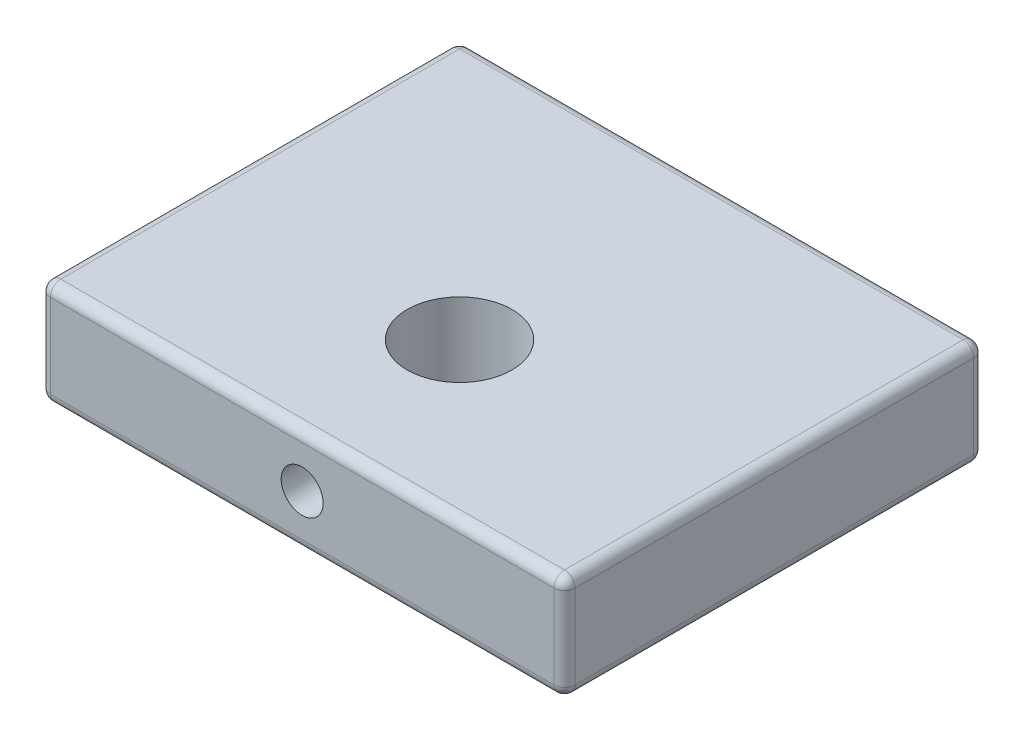
ISO-10303-21;
HEADER;
FILE_DESCRIPTION(('STEP AP214'),'2;1');
FILE_NAME('part.step','',(''),(''),'','','');
FILE_SCHEMA(('AUTOMOTIVE_DESIGN { 1 0 10303 214 1 1 1 1 }'));
ENDSEC;
DATA;
#1=APPLICATION_CONTEXT('core data for automotive mechanical design processes');
#2=APPLICATION_PROTOCOL_DEFINITION('international standard','automotive_design',2000,#1);
#3=PRODUCT_CONTEXT('',#1,'mechanical');
#4=PRODUCT('Part','Part','',(#3));
#5=PRODUCT_RELATED_PRODUCT_CATEGORY('part','',(#4));
#6=PRODUCT_DEFINITION_FORMATION('','',#4);
#7=PRODUCT_DEFINITION_CONTEXT('part definition',#1,'design');
#8=PRODUCT_DEFINITION('design','',#6,#7);
#9=PRODUCT_DEFINITION_SHAPE('','',#8);
#10=(LENGTH_UNIT() NAMED_UNIT(*) SI_UNIT(.MILLI.,.METRE.));
#11=(NAMED_UNIT(*) PLANE_ANGLE_UNIT() SI_UNIT($,.RADIAN.));
#12=(NAMED_UNIT(*) SI_UNIT($,.STERADIAN.) SOLID_ANGLE_UNIT());
#13=UNCERTAINTY_MEASURE_WITH_UNIT(LENGTH_MEASURE(1.E-05),#10,'distance_accuracy_value','');
#14=(GEOMETRIC_REPRESENTATION_CONTEXT(3) GLOBAL_UNCERTAINTY_ASSIGNED_CONTEXT((#13)) GLOBAL_UNIT_ASSIGNED_CONTEXT((#10,
#11,#12)) REPRESENTATION_CONTEXT('',''));
#15=CARTESIAN_POINT('',(0.,0.,0.));
#16=DIRECTION('',(0.,0.,1.));
#17=DIRECTION('',(1.,0.,0.));
#18=AXIS2_PLACEMENT_3D('',#15,#16,#17);
#19=CARTESIAN_POINT('',(0.,10.,0.));
#20=DIRECTION('',(0.,-1.,0.));
#21=DIRECTION('',(0.,0.,-1.));
#22=AXIS2_PLACEMENT_3D('',#19,#20,#21);
#23=PLANE('',#22);
#24=DIRECTION('',(-1.,0.,0.));
#25=VECTOR('',#24,1.);
#26=CARTESIAN_POINT('',(0.,10.,-24.));
#27=LINE('',#26,#25);
#28=CARTESIAN_POINT('',(24.,10.,-24.));
#29=VERTEX_POINT('',#28);
#30=CARTESIAN_POINT('',(-24.,10.,-24.));
#31=VERTEX_POINT('',#30);
#32=EDGE_CURVE('E169',#29,#31,#27,.T.);
#33=ORIENTED_EDGE('',*,*,#32,.T.);
#34=DIRECTION('',(0.,0.,1.));
#35=VECTOR('',#34,1.);
#36=CARTESIAN_POINT('',(-24.,10.,0.));
#37=LINE('',#36,#35);
#38=CARTESIAN_POINT('',(-24.,10.,14.));
#39=VERTEX_POINT('',#38);
#40=EDGE_CURVE('E140',#31,#39,#37,.T.);
#41=ORIENTED_EDGE('',*,*,#40,.T.);
#42=DIRECTION('',(1.,0.,0.));
#43=VECTOR('',#42,1.);
#44=CARTESIAN_POINT('',(0.,10.,14.));
#45=LINE('',#44,#43);
#46=CARTESIAN_POINT('',(24.,10.,14.));
#47=VERTEX_POINT('',#46);
#48=EDGE_CURVE('E158',#39,#47,#45,.T.);
#49=ORIENTED_EDGE('',*,*,#48,.T.);
#50=DIRECTION('',(0.,0.,-1.));
#51=VECTOR('',#50,1.);
#52=CARTESIAN_POINT('',(24.,10.,0.));
#53=LINE('',#52,#51);
#54=EDGE_CURVE('E164',#47,#29,#53,.T.);
#55=ORIENTED_EDGE('',*,*,#54,.T.);
#56=EDGE_LOOP('',(#33,#41,#49,#55));
#57=FACE_BOUND('',#56,.T.);
#58=CARTESIAN_POINT('',(0.,10.,0.));
#59=DIRECTION('',(0.,1.,0.));
#60=DIRECTION('',(0.,0.,1.));
#61=AXIS2_PLACEMENT_3D('',#58,#59,#60);
#62=CIRCLE('',#61,5.);
#63=CARTESIAN_POINT('',(0.,10.,5.));
#64=VERTEX_POINT('',#63);
#65=EDGE_CURVE('E165',#64,#64,#62,.T.);
#66=ORIENTED_EDGE('',*,*,#65,.F.);
#67=EDGE_LOOP('',(#66));
#68=FACE_BOUND('',#67,.T.);
#69=ADVANCED_FACE('F47',(#57,#68),#23,.F.);
#70=CARTESIAN_POINT('',(0.,0.,0.));
#71=DIRECTION('',(0.,-1.,0.));
#72=DIRECTION('',(0.,0.,-1.));
#73=AXIS2_PLACEMENT_3D('',#70,#71,#72);
#74=PLANE('',#73);
#75=DIRECTION('',(1.,0.,0.));
#76=VECTOR('',#75,1.);
#77=CARTESIAN_POINT('',(-25.,0.,14.));
#78=LINE('',#77,#76);
#79=CARTESIAN_POINT('',(24.,0.,14.));
#80=VERTEX_POINT('',#79);
#81=CARTESIAN_POINT('',(-24.,0.,14.));
#82=VERTEX_POINT('',#81);
#83=EDGE_CURVE('E191',#80,#82,#78,.F.);
#84=ORIENTED_EDGE('',*,*,#83,.T.);
#85=DIRECTION('',(0.,0.,1.));
#86=VECTOR('',#85,1.);
#87=CARTESIAN_POINT('',(-24.,0.,-25.));
#88=LINE('',#87,#86);
#89=CARTESIAN_POINT('',(-24.,0.,-24.));
#90=VERTEX_POINT('',#89);
#91=EDGE_CURVE('E197',#82,#90,#88,.F.);
#92=ORIENTED_EDGE('',*,*,#91,.T.);
#93=DIRECTION('',(-1.,0.,0.));
#94=VECTOR('',#93,1.);
#95=CARTESIAN_POINT('',(25.,0.,-24.));
#96=LINE('',#95,#94);
#97=CARTESIAN_POINT('',(24.,0.,-24.));
#98=VERTEX_POINT('',#97);
#99=EDGE_CURVE('E195',#90,#98,#96,.F.);
#100=ORIENTED_EDGE('',*,*,#99,.T.);
#101=DIRECTION('',(0.,0.,-1.));
#102=VECTOR('',#101,1.);
#103=CARTESIAN_POINT('',(24.,0.,15.));
#104=LINE('',#103,#102);
#105=EDGE_CURVE('E193',#98,#80,#104,.F.);
#106=ORIENTED_EDGE('',*,*,#105,.T.);
#107=EDGE_LOOP('',(#84,#92,#100,#106));
#108=FACE_BOUND('',#107,.T.);
#109=CARTESIAN_POINT('',(-11.3137084989848,0.,-11.3137084989847));
#110=DIRECTION('',(0.,-1.,0.));
#111=DIRECTION('',(0.,0.,-1.));
#112=AXIS2_PLACEMENT_3D('',#109,#110,#111);
#113=CIRCLE('',#112,0.750000000000002);
#114=CARTESIAN_POINT('',(-11.3137084989848,0.,-12.0637084989847));
#115=VERTEX_POINT('',#114);
#116=EDGE_CURVE('E456',#115,#115,#113,.T.);
#117=ORIENTED_EDGE('',*,*,#116,.F.);
#118=EDGE_LOOP('',(#117));
#119=FACE_BOUND('',#118,.T.);
#120=CARTESIAN_POINT('',(11.3137084989847,0.,-11.3137084989848));
#121=DIRECTION('',(0.,-1.,0.));
#122=DIRECTION('',(0.,0.,-1.));
#123=AXIS2_PLACEMENT_3D('',#120,#121,#122);
#124=CIRCLE('',#123,0.749999999999998);
#125=CARTESIAN_POINT('',(11.3137084989847,0.,-12.0637084989848));
#126=VERTEX_POINT('',#125);
#127=EDGE_CURVE('E460',#126,#126,#124,.T.);
#128=ORIENTED_EDGE('',*,*,#127,.F.);
#129=EDGE_LOOP('',(#128));
#130=FACE_BOUND('',#129,.T.);
#131=CARTESIAN_POINT('',(11.3137084989848,0.,11.3137084989847));
#132=DIRECTION('',(0.,-1.,0.));
#133=DIRECTION('',(0.,0.,-1.));
#134=AXIS2_PLACEMENT_3D('',#131,#132,#133);
#135=CIRCLE('',#134,0.749999999999998);
#136=CARTESIAN_POINT('',(11.3137084989848,0.,10.5637084989847));
#137=VERTEX_POINT('',#136);
#138=EDGE_CURVE('E288',#137,#137,#135,.T.);
#139=ORIENTED_EDGE('',*,*,#138,.F.);
#140=EDGE_LOOP('',(#139));
#141=FACE_BOUND('',#140,.T.);
#142=CARTESIAN_POINT('',(-11.3137084989847,0.,11.3137084989848));
#143=DIRECTION('',(0.,-1.,0.));
#144=DIRECTION('',(0.,0.,-1.));
#145=AXIS2_PLACEMENT_3D('',#142,#143,#144);
#146=CIRCLE('',#145,0.749999999999996);
#147=CARTESIAN_POINT('',(-11.3137084989847,0.,10.5637084989848));
#148=VERTEX_POINT('',#147);
#149=EDGE_CURVE('E467',#148,#148,#146,.T.);
#150=ORIENTED_EDGE('',*,*,#149,.F.);
#151=EDGE_LOOP('',(#150));
#152=FACE_BOUND('',#151,.T.);
#153=CARTESIAN_POINT('',(0.,0.,0.));
#154=DIRECTION('',(0.,1.,0.));
#155=DIRECTION('',(0.,0.,1.));
#156=AXIS2_PLACEMENT_3D('',#153,#154,#155);
#157=CIRCLE('',#156,5.);
#158=CARTESIAN_POINT('',(0.,0.,5.));
#159=VERTEX_POINT('',#158);
#160=EDGE_CURVE('E470',#159,#159,#157,.T.);
#161=ORIENTED_EDGE('',*,*,#160,.T.);
#162=EDGE_LOOP('',(#161));
#163=FACE_BOUND('',#162,.T.);
#164=ADVANCED_FACE('F334',(#108,#119,#130,#141,#152,#163),#74,.T.);
#165=CARTESIAN_POINT('',(25.,10.,-25.));
#166=DIRECTION('',(-1.,0.,0.));
#167=DIRECTION('',(0.,0.,1.));
#168=AXIS2_PLACEMENT_3D('',#165,#166,#167);
#169=PLANE('',#168);
#170=DIRECTION('',(0.,0.,-1.));
#171=VECTOR('',#170,1.);
#172=CARTESIAN_POINT('',(25.,9.,-25.));
#173=LINE('',#172,#171);
#174=CARTESIAN_POINT('',(25.,9.,-24.));
#175=VERTEX_POINT('',#174);
#176=CARTESIAN_POINT('',(25.,9.,14.));
#177=VERTEX_POINT('',#176);
#178=EDGE_CURVE('E56',#175,#177,#173,.F.);
#179=ORIENTED_EDGE('',*,*,#178,.T.);
#180=DIRECTION('',(0.,-1.,0.));
#181=VECTOR('',#180,1.);
#182=CARTESIAN_POINT('',(25.,10.,14.));
#183=LINE('',#182,#181);
#184=CARTESIAN_POINT('',(25.,0.999999999999999,14.));
#185=VERTEX_POINT('',#184);
#186=EDGE_CURVE('E11',#177,#185,#183,.T.);
#187=ORIENTED_EDGE('',*,*,#186,.T.);
#188=DIRECTION('',(0.,0.,-1.));
#189=VECTOR('',#188,1.);
#190=CARTESIAN_POINT('',(25.,0.999999999999999,-25.));
#191=LINE('',#190,#189);
#192=CARTESIAN_POINT('',(25.,0.999999999999999,-24.));
#193=VERTEX_POINT('',#192);
#194=EDGE_CURVE('E209',#185,#193,#191,.T.);
#195=ORIENTED_EDGE('',*,*,#194,.T.);
#196=DIRECTION('',(0.,-1.,0.));
#197=VECTOR('',#196,1.);
#198=CARTESIAN_POINT('',(25.,10.,-24.));
#199=LINE('',#198,#197);
#200=EDGE_CURVE('E67',#193,#175,#199,.F.);
#201=ORIENTED_EDGE('',*,*,#200,.T.);
#202=EDGE_LOOP('',(#179,#187,#195,#201));
#203=FACE_BOUND('',#202,.T.);
#204=ADVANCED_FACE('F337',(#203),#169,.F.);
#205=CARTESIAN_POINT('',(25.,10.,-25.));
#206=DIRECTION('',(0.,0.,1.));
#207=DIRECTION('',(1.,0.,0.));
#208=AXIS2_PLACEMENT_3D('',#205,#206,#207);
#209=PLANE('',#208);
#210=DIRECTION('',(0.,-1.,0.));
#211=VECTOR('',#210,1.);
#212=CARTESIAN_POINT('',(-24.,10.,-25.));
#213=LINE('',#212,#211);
#214=CARTESIAN_POINT('',(-24.,0.999999999999999,-25.));
#215=VERTEX_POINT('',#214);
#216=CARTESIAN_POINT('',(-24.,9.,-25.));
#217=VERTEX_POINT('',#216);
#218=EDGE_CURVE('E204',#215,#217,#213,.F.);
#219=ORIENTED_EDGE('',*,*,#218,.T.);
#220=DIRECTION('',(-1.,0.,0.));
#221=VECTOR('',#220,1.);
#222=CARTESIAN_POINT('',(25.,9.,-25.));
#223=LINE('',#222,#221);
#224=CARTESIAN_POINT('',(24.,9.,-25.));
#225=VERTEX_POINT('',#224);
#226=EDGE_CURVE('E206',#217,#225,#223,.F.);
#227=ORIENTED_EDGE('',*,*,#226,.T.);
#228=DIRECTION('',(0.,-1.,0.));
#229=VECTOR('',#228,1.);
#230=CARTESIAN_POINT('',(24.,10.,-25.));
#231=LINE('',#230,#229);
#232=CARTESIAN_POINT('',(24.,0.999999999999999,-25.));
#233=VERTEX_POINT('',#232);
#234=EDGE_CURVE('E200',#225,#233,#231,.T.);
#235=ORIENTED_EDGE('',*,*,#234,.T.);
#236=DIRECTION('',(-1.,0.,0.));
#237=VECTOR('',#236,1.);
#238=CARTESIAN_POINT('',(-25.,0.999999999999999,-25.));
#239=LINE('',#238,#237);
#240=EDGE_CURVE('E202',#233,#215,#239,.T.);
#241=ORIENTED_EDGE('',*,*,#240,.T.);
#242=EDGE_LOOP('',(#219,#227,#235,#241));
#243=FACE_BOUND('',#242,.T.);
#244=ADVANCED_FACE('F345',(#243),#209,.F.);
#245=CARTESIAN_POINT('',(-25.,10.,-25.));
#246=DIRECTION('',(1.,0.,0.));
#247=DIRECTION('',(0.,0.,-1.));
#248=AXIS2_PLACEMENT_3D('',#245,#246,#247);
#249=PLANE('',#248);
#250=DIRECTION('',(0.,-1.,0.));
#251=VECTOR('',#250,1.);
#252=CARTESIAN_POINT('',(-25.,10.,14.));
#253=LINE('',#252,#251);
#254=CARTESIAN_POINT('',(-25.,0.999999999999999,14.));
#255=VERTEX_POINT('',#254);
#256=CARTESIAN_POINT('',(-25.,9.,14.));
#257=VERTEX_POINT('',#256);
#258=EDGE_CURVE('E179',#255,#257,#253,.F.);
#259=ORIENTED_EDGE('',*,*,#258,.T.);
#260=DIRECTION('',(0.,0.,1.));
#261=VECTOR('',#260,1.);
#262=CARTESIAN_POINT('',(-25.,9.,-25.));
#263=LINE('',#262,#261);
#264=CARTESIAN_POINT('',(-25.,9.,-24.));
#265=VERTEX_POINT('',#264);
#266=EDGE_CURVE('E142',#257,#265,#263,.F.);
#267=ORIENTED_EDGE('',*,*,#266,.T.);
#268=DIRECTION('',(0.,-1.,0.));
#269=VECTOR('',#268,1.);
#270=CARTESIAN_POINT('',(-25.,10.,-24.));
#271=LINE('',#270,#269);
#272=CARTESIAN_POINT('',(-25.,0.999999999999999,-24.));
#273=VERTEX_POINT('',#272);
#274=EDGE_CURVE('E171',#265,#273,#271,.T.);
#275=ORIENTED_EDGE('',*,*,#274,.T.);
#276=DIRECTION('',(0.,0.,1.));
#277=VECTOR('',#276,1.);
#278=CARTESIAN_POINT('',(-25.,0.999999999999999,15.));
#279=LINE('',#278,#277);
#280=EDGE_CURVE('E173',#273,#255,#279,.T.);
#281=ORIENTED_EDGE('',*,*,#280,.T.);
#282=EDGE_LOOP('',(#259,#267,#275,#281));
#283=FACE_BOUND('',#282,.T.);
#284=ADVANCED_FACE('F341',(#283),#249,.F.);
#285=CARTESIAN_POINT('',(25.,10.,15.));
#286=DIRECTION('',(0.,0.,-1.));
#287=DIRECTION('',(-1.,0.,0.));
#288=AXIS2_PLACEMENT_3D('',#285,#286,#287);
#289=PLANE('',#288);
#290=DIRECTION('',(0.,-1.,0.));
#291=VECTOR('',#290,1.);
#292=CARTESIAN_POINT('',(-24.,10.,15.));
#293=LINE('',#292,#291);
#294=CARTESIAN_POINT('',(-24.,9.,15.));
#295=VERTEX_POINT('',#294);
#296=CARTESIAN_POINT('',(-24.,0.999999999999999,15.));
#297=VERTEX_POINT('',#296);
#298=EDGE_CURVE('E186',#295,#297,#293,.T.);
#299=ORIENTED_EDGE('',*,*,#298,.T.);
#300=DIRECTION('',(1.,0.,0.));
#301=VECTOR('',#300,1.);
#302=CARTESIAN_POINT('',(25.,0.999999999999999,15.));
#303=LINE('',#302,#301);
#304=CARTESIAN_POINT('',(24.,0.999999999999999,15.));
#305=VERTEX_POINT('',#304);
#306=EDGE_CURVE('E189',#297,#305,#303,.T.);
#307=ORIENTED_EDGE('',*,*,#306,.T.);
#308=DIRECTION('',(0.,-1.,0.));
#309=VECTOR('',#308,1.);
#310=CARTESIAN_POINT('',(24.,10.,15.));
#311=LINE('',#310,#309);
#312=CARTESIAN_POINT('',(24.,9.,15.));
#313=VERTEX_POINT('',#312);
#314=EDGE_CURVE('E184',#305,#313,#311,.F.);
#315=ORIENTED_EDGE('',*,*,#314,.T.);
#316=DIRECTION('',(1.,0.,0.));
#317=VECTOR('',#316,1.);
#318=CARTESIAN_POINT('',(25.,9.,15.));
#319=LINE('',#318,#317);
#320=EDGE_CURVE('E182',#313,#295,#319,.F.);
#321=ORIENTED_EDGE('',*,*,#320,.T.);
#322=EDGE_LOOP('',(#299,#307,#315,#321));
#323=FACE_BOUND('',#322,.T.);
#324=CARTESIAN_POINT('',(0.,5.,15.));
#325=DIRECTION('',(0.,0.,1.));
#326=DIRECTION('',(1.,0.,0.));
#327=AXIS2_PLACEMENT_3D('',#324,#325,#326);
#328=CIRCLE('',#327,2.);
#329=CARTESIAN_POINT('',(2.,5.,15.));
#330=VERTEX_POINT('',#329);
#331=EDGE_CURVE('E275',#330,#330,#328,.T.);
#332=ORIENTED_EDGE('',*,*,#331,.F.);
#333=EDGE_LOOP('',(#332));
#334=FACE_BOUND('',#333,.T.);
#335=ADVANCED_FACE('F331',(#323,#334),#289,.F.);
#336=CARTESIAN_POINT('',(0.,10.,0.));
#337=DIRECTION('',(0.,-1.,0.));
#338=DIRECTION('',(0.,0.,-1.));
#339=AXIS2_PLACEMENT_3D('',#336,#337,#338);
#340=CYLINDRICAL_SURFACE('',#339,5.);
#341=CARTESIAN_POINT('',(2.,5.,4.58257569495584));
#342=CARTESIAN_POINT('',(1.99999540068023,5.10712368971296,4.58258022779737));
#343=CARTESIAN_POINT('',(1.99134173553407,5.21442629433184,4.58638433797122));
#344=CARTESIAN_POINT('',(1.95706710874823,5.42593908409957,4.601110833066));
#345=CARTESIAN_POINT('',(1.93140279032341,5.53014065433852,4.61205140628347));
#346=CARTESIAN_POINT('',(1.86423554476216,5.73205180897083,4.63960410719222));
#347=CARTESIAN_POINT('',(1.82279228998551,5.82978424329122,4.65619484260882));
#348=CARTESIAN_POINT('',(1.72542013194152,6.0168853548623,4.69314677188873));
#349=CARTESIAN_POINT('',(1.66949439157707,6.10625585252411,4.71350714220611));
#350=CARTESIAN_POINT('',(1.54132201423254,6.27926031454433,4.75700861562336));
#351=CARTESIAN_POINT('',(1.46837936836551,6.36235639939724,4.78023917022606));
#352=CARTESIAN_POINT('',(1.30970909513216,6.5155290208558,4.82612457915277));
#353=CARTESIAN_POINT('',(1.22397701877347,6.5856010077097,4.84877922991761));
#354=CARTESIAN_POINT('',(1.03800631337303,6.71340639030971,4.89203407641395));
#355=CARTESIAN_POINT('',(0.937328966419096,6.77054429968594,4.9125180361257));
#356=CARTESIAN_POINT('',(0.726825322068641,6.86684357017379,4.94803927702516));
#357=CARTESIAN_POINT('',(0.617002769076886,6.90601224624887,4.96307877403249));
#358=CARTESIAN_POINT('',(0.396966427039757,6.96334148599309,4.98538324990609));
#359=CARTESIAN_POINT('',(0.28702898485832,6.98242731397022,4.99298936770628));
#360=CARTESIAN_POINT('',(0.0652663285839653,7.00202848578145,5.00080310687431));
#361=CARTESIAN_POINT('',(-0.046558165839408,7.0025507559658,5.00101348770556));
#362=CARTESIAN_POINT('',(-0.262232494702086,6.9855172301958,4.99421962820612));
#363=CARTESIAN_POINT('',(-0.366177452870454,6.96897522724529,4.98761996771485));
#364=CARTESIAN_POINT('',(-0.569673109221911,6.92000712369703,4.96849291469141));
#365=CARTESIAN_POINT('',(-0.669223484391236,6.88757985760154,4.95596508721342));
#366=CARTESIAN_POINT('',(-0.862897938510555,6.80736351712174,4.92596824457467));
#367=CARTESIAN_POINT('',(-0.956917623378892,6.75935028518462,4.90842760466223));
#368=CARTESIAN_POINT('',(-1.13580815074131,6.64953499308084,4.87014585180275));
#369=CARTESIAN_POINT('',(-1.22067584271796,6.58772820689983,4.84940364267149));
#370=CARTESIAN_POINT('',(-1.38476882799017,6.44735086405612,4.80521637176123));
#371=CARTESIAN_POINT('',(-1.46325784526632,6.3679461074272,4.78168326511759));
#372=CARTESIAN_POINT('',(-1.60610741539265,6.197009428168,4.73561660973263));
#373=CARTESIAN_POINT('',(-1.67046334378698,6.1054735518044,4.71308339008077));
#374=CARTESIAN_POINT('',(-1.78490418871927,5.90958097762606,4.67096897409023));
#375=CARTESIAN_POINT('',(-1.83453465163626,5.80493516966135,4.65148914057708));
#376=CARTESIAN_POINT('',(-1.91517625986646,5.58778450968778,4.61887590344085));
#377=CARTESIAN_POINT('',(-1.94619949837798,5.47528481527341,4.60573837891311));
#378=CARTESIAN_POINT('',(-1.98695494885489,5.25296422253257,4.58829759702716));
#379=CARTESIAN_POINT('',(-1.99787209681454,5.14339955287144,4.58350366456138));
#380=CARTESIAN_POINT('',(-2.00156132644288,4.92392279224044,4.58189497869038));
#381=CARTESIAN_POINT('',(-1.99433891059128,4.81401081672435,4.58507780560362));
#382=CARTESIAN_POINT('',(-1.96303289479003,4.60354106504306,4.59856044359114));
#383=CARTESIAN_POINT('',(-1.93993306202386,4.50280706259994,4.60844457798302));
#384=CARTESIAN_POINT('',(-1.87880418691087,4.30671159521455,4.6337005102734));
#385=CARTESIAN_POINT('',(-1.84077183430227,4.21135132689285,4.64907352488598));
#386=CARTESIAN_POINT('',(-1.74913563948157,4.02439764220435,4.68433781860101));
#387=CARTESIAN_POINT('',(-1.69496286826465,3.93311381130547,4.70438704639177));
#388=CARTESIAN_POINT('',(-1.57316522444182,3.76051701255841,4.74650385157795));
#389=CARTESIAN_POINT('',(-1.50553487348189,3.67920812720455,4.76857224896045));
#390=CARTESIAN_POINT('',(-1.35284421168058,3.52262659140063,4.81420915971416));
#391=CARTESIAN_POINT('',(-1.26686542944543,3.4482434347084,4.83776807285233));
#392=CARTESIAN_POINT('',(-1.0830836333685,3.31482292339023,4.88219794567532));
#393=CARTESIAN_POINT('',(-0.985280138466608,3.25578619340488,4.90306879593136));
#394=CARTESIAN_POINT('',(-0.780279934003015,3.15495237353666,4.9398371590039));
#395=CARTESIAN_POINT('',(-0.673085480998744,3.11315115582634,4.9557358624066));
#396=CARTESIAN_POINT('',(-0.452393590914547,3.04845114760024,4.98072713468904));
#397=CARTESIAN_POINT('',(-0.338899610276819,3.02554209858931,4.98982339706103));
#398=CARTESIAN_POINT('',(-0.116816510362615,3.00049529834716,4.99979008211858));
#399=CARTESIAN_POINT('',(-0.00839049265208641,2.99709987143797,5.00115846749745));
#400=CARTESIAN_POINT('',(0.207433835792266,3.00785547938347,4.99686042373721));
#401=CARTESIAN_POINT('',(0.314832299614387,3.02200385815558,4.99119505948774));
#402=CARTESIAN_POINT('',(0.522170901733398,3.06654678799988,4.97371513381836));
#403=CARTESIAN_POINT('',(0.622238803864869,3.09642894475655,4.96209480698998));
#404=CARTESIAN_POINT('',(0.815922355542604,3.17105280588107,4.93394947767358));
#405=CARTESIAN_POINT('',(0.909536811189122,3.21579725093909,4.91742357062859));
#406=CARTESIAN_POINT('',(1.09220303880515,3.32110319335323,4.88018094611867));
#407=CARTESIAN_POINT('',(1.18087037518738,3.38227627532513,4.859311306872));
#408=CARTESIAN_POINT('',(1.34705404014793,3.51778853874699,4.8158940222708));
#409=CARTESIAN_POINT('',(1.42456572919735,3.59213316960821,4.79334568464253));
#410=CARTESIAN_POINT('',(1.57120121894449,3.75731514684866,4.7473776736768));
#411=CARTESIAN_POINT('',(1.63950871002775,3.8488885751441,4.72399047228096));
#412=CARTESIAN_POINT('',(1.75984762763149,4.04294243572083,4.68049656850749));
#413=CARTESIAN_POINT('',(1.81187714055767,4.14542414845354,4.66039025195448));
#414=CARTESIAN_POINT('',(1.89399048451634,4.3490361864702,4.62758914239063));
#415=CARTESIAN_POINT('',(1.92562535665267,4.44946160271244,4.61439096680415));
#416=CARTESIAN_POINT('',(1.97271990928489,4.65448904149264,4.5944582603412));
#417=CARTESIAN_POINT('',(1.98822466191608,4.75907857342435,4.58770572290435));
#418=CARTESIAN_POINT('',(1.99692202185513,4.88677823911152,4.5839176394209));
#419=CARTESIAN_POINT('',(1.99807530751895,4.90940148035643,4.58341531117284));
#420=CARTESIAN_POINT('',(1.99961481124251,4.95468047679722,4.58274384722722));
#421=CARTESIAN_POINT('',(2.0000009730612,4.97733623425516,4.5825747359592));
#422=CARTESIAN_POINT('',(2.,5.,4.58257569495584));
#423=B_SPLINE_CURVE_WITH_KNOTS('',3,(#341,#342,#343,#344,#345,#346,#347,#348,#349,#350,#351,
#352,#353,#354,#355,#356,#357,#358,#359,#360,#361,#362,#363,#364,#365,#366,#367,#368,#369,#370,
#371,#372,#373,#374,#375,#376,#377,#378,#379,#380,#381,#382,#383,#384,#385,#386,#387,#388,#389,
#390,#391,#392,#393,#394,#395,#396,#397,#398,#399,#400,#401,#402,#403,#404,#405,#406,#407,#408,
#409,#410,#411,#412,#413,#414,#415,#416,#417,#418,#419,#420,#421,#422),.UNSPECIFIED.,.T.,.F.,(4,
2,2,2,2,2,2,2,2,2,2,2,2,2,2,2,2,2,2,2,2,2,2,2,2,2,2,2,2,2,2,2,2,2,2,2,2,2,2,2,4),(0.,
0.321277648767653,0.643377335822245,0.96427082329339,1.28509428823861,1.62255618284425,
1.96013574348342,2.31102669091428,2.6617746696948,2.99554182887183,3.32918445305672,
3.64408644830302,3.95901155129059,4.27868300234898,4.59846414940031,4.93924044081355,
5.28012807127127,5.63064458717257,5.98093304800101,6.3098214752442,6.63861014907939,
6.94867248085145,7.25880358651637,7.581511546527,7.90435114525849,8.25103734246979,
8.59773764852747,8.94435487312812,9.29078375954136,9.61461039755952,9.93838801512601,
10.2522199444335,10.5661097782858,10.8938705113992,11.2217671656421,11.5699625328561,
11.9181988175919,12.2351666081908,12.5512463021924,12.619212852096,12.6871843847255),.UNSPECIFIED.);
#424=CARTESIAN_POINT('',(2.,5.,4.58257569495584));
#425=VERTEX_POINT('',#424);
#426=EDGE_CURVE('E269',#425,#425,#423,.T.);
#427=ORIENTED_EDGE('',*,*,#426,.T.);
#428=EDGE_LOOP('',(#427));
#429=FACE_BOUND('',#428,.T.);
#430=ORIENTED_EDGE('',*,*,#65,.T.);
#431=EDGE_LOOP('',(#430));
#432=FACE_BOUND('',#431,.T.);
#433=ORIENTED_EDGE('',*,*,#160,.F.);
#434=EDGE_LOOP('',(#433));
#435=FACE_BOUND('',#434,.T.);
#436=ADVANCED_FACE('F327',(#429,#432,#435),#340,.F.);
#437=CARTESIAN_POINT('',(-11.3137084989847,5.,11.3137084989848));
#438=DIRECTION('',(0.,-1.,0.));
#439=DIRECTION('',(0.,0.,-1.));
#440=AXIS2_PLACEMENT_3D('',#437,#438,#439);
#441=CYLINDRICAL_SURFACE('',#440,0.749999999999996);
#442=CARTESIAN_POINT('',(-11.3137084989847,5.,11.3137084989848));
#443=DIRECTION('',(0.,-1.,0.));
#444=DIRECTION('',(0.,0.,-1.));
#445=AXIS2_PLACEMENT_3D('',#442,#443,#444);
#446=CIRCLE('',#445,0.749999999999996);
#447=CARTESIAN_POINT('',(-11.3137084989847,5.,10.5637084989848));
#448=VERTEX_POINT('',#447);
#449=EDGE_CURVE('E472',#448,#448,#446,.T.);
#450=ORIENTED_EDGE('',*,*,#449,.F.);
#451=EDGE_LOOP('',(#450));
#452=FACE_BOUND('',#451,.T.);
#453=ORIENTED_EDGE('',*,*,#149,.T.);
#454=EDGE_LOOP('',(#453));
#455=FACE_BOUND('',#454,.T.);
#456=ADVANCED_FACE('F323',(#452,#455),#441,.F.);
#457=CARTESIAN_POINT('',(-11.3137084989847,5.,11.3137084989848));
#458=DIRECTION('',(0.,-1.,0.));
#459=DIRECTION('',(0.,0.,-1.));
#460=AXIS2_PLACEMENT_3D('',#457,#458,#459);
#461=PLANE('',#460);
#462=ORIENTED_EDGE('',*,*,#449,.T.);
#463=EDGE_LOOP('',(#462));
#464=FACE_BOUND('',#463,.T.);
#465=ADVANCED_FACE('F301',(#464),#461,.T.);
#466=CARTESIAN_POINT('',(11.3137084989848,5.,11.3137084989847));
#467=DIRECTION('',(0.,-1.,0.));
#468=DIRECTION('',(0.,0.,-1.));
#469=AXIS2_PLACEMENT_3D('',#466,#467,#468);
#470=CYLINDRICAL_SURFACE('',#469,0.749999999999998);
#471=CARTESIAN_POINT('',(11.3137084989848,5.,11.3137084989847));
#472=DIRECTION('',(0.,-1.,0.));
#473=DIRECTION('',(0.,0.,-1.));
#474=AXIS2_PLACEMENT_3D('',#471,#472,#473);
#475=CIRCLE('',#474,0.749999999999998);
#476=CARTESIAN_POINT('',(11.3137084989848,5.,10.5637084989847));
#477=VERTEX_POINT('',#476);
#478=EDGE_CURVE('E486',#477,#477,#475,.T.);
#479=ORIENTED_EDGE('',*,*,#478,.F.);
#480=EDGE_LOOP('',(#479));
#481=FACE_BOUND('',#480,.T.);
#482=ORIENTED_EDGE('',*,*,#138,.T.);
#483=EDGE_LOOP('',(#482));
#484=FACE_BOUND('',#483,.T.);
#485=ADVANCED_FACE('F297',(#481,#484),#470,.F.);
#486=CARTESIAN_POINT('',(11.3137084989848,5.,11.3137084989847));
#487=DIRECTION('',(0.,-1.,0.));
#488=DIRECTION('',(0.,0.,-1.));
#489=AXIS2_PLACEMENT_3D('',#486,#487,#488);
#490=PLANE('',#489);
#491=ORIENTED_EDGE('',*,*,#478,.T.);
#492=EDGE_LOOP('',(#491));
#493=FACE_BOUND('',#492,.T.);
#494=ADVANCED_FACE('F300',(#493),#490,.T.);
#495=CARTESIAN_POINT('',(11.3137084989847,5.,-11.3137084989848));
#496=DIRECTION('',(0.,-1.,0.));
#497=DIRECTION('',(0.,0.,-1.));
#498=AXIS2_PLACEMENT_3D('',#495,#496,#497);
#499=CYLINDRICAL_SURFACE('',#498,0.749999999999998);
#500=CARTESIAN_POINT('',(11.3137084989847,5.,-11.3137084989848));
#501=DIRECTION('',(0.,-1.,0.));
#502=DIRECTION('',(0.,0.,-1.));
#503=AXIS2_PLACEMENT_3D('',#500,#501,#502);
#504=CIRCLE('',#503,0.749999999999998);
#505=CARTESIAN_POINT('',(11.3137084989847,5.,-12.0637084989848));
#506=VERTEX_POINT('',#505);
#507=EDGE_CURVE('E483',#506,#506,#504,.T.);
#508=ORIENTED_EDGE('',*,*,#507,.F.);
#509=EDGE_LOOP('',(#508));
#510=FACE_BOUND('',#509,.T.);
#511=ORIENTED_EDGE('',*,*,#127,.T.);
#512=EDGE_LOOP('',(#511));
#513=FACE_BOUND('',#512,.T.);
#514=ADVANCED_FACE('F305',(#510,#513),#499,.F.);
#515=CARTESIAN_POINT('',(11.3137084989847,5.,-11.3137084989848));
#516=DIRECTION('',(0.,-1.,0.));
#517=DIRECTION('',(0.,0.,-1.));
#518=AXIS2_PLACEMENT_3D('',#515,#516,#517);
#519=PLANE('',#518);
#520=ORIENTED_EDGE('',*,*,#507,.T.);
#521=EDGE_LOOP('',(#520));
#522=FACE_BOUND('',#521,.T.);
#523=ADVANCED_FACE('F309',(#522),#519,.T.);
#524=CARTESIAN_POINT('',(-11.3137084989848,5.,-11.3137084989847));
#525=DIRECTION('',(0.,-1.,0.));
#526=DIRECTION('',(0.,0.,-1.));
#527=AXIS2_PLACEMENT_3D('',#524,#525,#526);
#528=CYLINDRICAL_SURFACE('',#527,0.750000000000002);
#529=CARTESIAN_POINT('',(-11.3137084989848,5.,-11.3137084989847));
#530=DIRECTION('',(0.,-1.,0.));
#531=DIRECTION('',(0.,0.,-1.));
#532=AXIS2_PLACEMENT_3D('',#529,#530,#531);
#533=CIRCLE('',#532,0.750000000000002);
#534=CARTESIAN_POINT('',(-11.3137084989848,5.,-12.0637084989847));
#535=VERTEX_POINT('',#534);
#536=EDGE_CURVE('E280',#535,#535,#533,.T.);
#537=ORIENTED_EDGE('',*,*,#536,.F.);
#538=EDGE_LOOP('',(#537));
#539=FACE_BOUND('',#538,.T.);
#540=ORIENTED_EDGE('',*,*,#116,.T.);
#541=EDGE_LOOP('',(#540));
#542=FACE_BOUND('',#541,.T.);
#543=ADVANCED_FACE('F313',(#539,#542),#528,.F.);
#544=CARTESIAN_POINT('',(-11.3137084989848,5.,-11.3137084989847));
#545=DIRECTION('',(0.,-1.,0.));
#546=DIRECTION('',(0.,0.,-1.));
#547=AXIS2_PLACEMENT_3D('',#544,#545,#546);
#548=PLANE('',#547);
#549=ORIENTED_EDGE('',*,*,#536,.T.);
#550=EDGE_LOOP('',(#549));
#551=FACE_BOUND('',#550,.T.);
#552=ADVANCED_FACE('F295',(#551),#548,.T.);
#553=CARTESIAN_POINT('',(0.,5.,-25.001));
#554=DIRECTION('',(0.,0.,1.));
#555=DIRECTION('',(1.,0.,0.));
#556=AXIS2_PLACEMENT_3D('',#553,#554,#555);
#557=CYLINDRICAL_SURFACE('',#556,2.);
#558=ORIENTED_EDGE('',*,*,#426,.F.);
#559=EDGE_LOOP('',(#558));
#560=FACE_BOUND('',#559,.T.);
#561=ORIENTED_EDGE('',*,*,#331,.T.);
#562=EDGE_LOOP('',(#561));
#563=FACE_BOUND('',#562,.T.);
#564=ADVANCED_FACE('F290',(#560,#563),#557,.F.);
#565=CARTESIAN_POINT('',(24.,0.999999999999999,-25.));
#566=DIRECTION('',(0.,0.,1.));
#567=DIRECTION('',(1.,0.,0.));
#568=AXIS2_PLACEMENT_3D('',#565,#566,#567);
#569=CYLINDRICAL_SURFACE('',#568,1.);
#570=CARTESIAN_POINT('',(24.,0.999999999999999,-24.));
#571=DIRECTION('',(0.,0.,-1.));
#572=DIRECTION('',(-1.,0.,0.));
#573=AXIS2_PLACEMENT_3D('',#570,#571,#572);
#574=CIRCLE('',#573,1.);
#575=EDGE_CURVE('E51',#193,#98,#574,.T.);
#576=ORIENTED_EDGE('',*,*,#575,.F.);
#577=ORIENTED_EDGE('',*,*,#194,.F.);
#578=CARTESIAN_POINT('',(24.,1.,14.));
#579=DIRECTION('',(0.,0.,1.));
#580=DIRECTION('',(1.,0.,0.));
#581=AXIS2_PLACEMENT_3D('',#578,#579,#580);
#582=CIRCLE('',#581,1.);
#583=EDGE_CURVE('E261',#80,#185,#582,.T.);
#584=ORIENTED_EDGE('',*,*,#583,.F.);
#585=ORIENTED_EDGE('',*,*,#105,.F.);
#586=EDGE_LOOP('',(#576,#577,#584,#585));
#587=FACE_BOUND('',#586,.T.);
#588=ADVANCED_FACE('F49',(#587),#569,.T.);
#589=CARTESIAN_POINT('',(24.,1.,-24.));
#590=DIRECTION('',(0.,-1.,0.));
#591=DIRECTION('',(0.,0.,-1.));
#592=AXIS2_PLACEMENT_3D('',#589,#590,#591);
#593=SPHERICAL_SURFACE('',#592,1.);
#594=CARTESIAN_POINT('',(24.,0.999999999999999,-24.));
#595=DIRECTION('',(0.,-1.,0.));
#596=DIRECTION('',(0.,0.,-1.));
#597=AXIS2_PLACEMENT_3D('',#594,#595,#596);
#598=CIRCLE('',#597,1.);
#599=EDGE_CURVE('E256',#193,#233,#598,.F.);
#600=ORIENTED_EDGE('',*,*,#599,.F.);
#601=ORIENTED_EDGE('',*,*,#575,.T.);
#602=CARTESIAN_POINT('',(24.,1.,-24.));
#603=DIRECTION('',(1.,0.,0.));
#604=DIRECTION('',(0.,0.,-1.));
#605=AXIS2_PLACEMENT_3D('',#602,#603,#604);
#606=CIRCLE('',#605,1.);
#607=EDGE_CURVE('E259',#233,#98,#606,.F.);
#608=ORIENTED_EDGE('',*,*,#607,.F.);
#609=EDGE_LOOP('',(#600,#601,#608));
#610=FACE_BOUND('',#609,.T.);
#611=ADVANCED_FACE('F416',(#610),#593,.T.);
#612=CARTESIAN_POINT('',(24.,1.,14.));
#613=DIRECTION('',(1.,0.,0.));
#614=DIRECTION('',(0.,0.,-1.));
#615=AXIS2_PLACEMENT_3D('',#612,#613,#614);
#616=SPHERICAL_SURFACE('',#615,1.);
#617=CARTESIAN_POINT('',(24.,0.999999999999999,14.));
#618=DIRECTION('',(1.,0.,0.));
#619=DIRECTION('',(0.,0.,-1.));
#620=AXIS2_PLACEMENT_3D('',#617,#618,#619);
#621=CIRCLE('',#620,1.);
#622=EDGE_CURVE('E251',#80,#305,#621,.F.);
#623=ORIENTED_EDGE('',*,*,#622,.F.);
#624=ORIENTED_EDGE('',*,*,#583,.T.);
#625=CARTESIAN_POINT('',(24.,0.999999999999999,14.));
#626=DIRECTION('',(0.,-1.,0.));
#627=DIRECTION('',(0.,0.,-1.));
#628=AXIS2_PLACEMENT_3D('',#625,#626,#627);
#629=CIRCLE('',#628,1.);
#630=EDGE_CURVE('E254',#305,#185,#629,.F.);
#631=ORIENTED_EDGE('',*,*,#630,.F.);
#632=EDGE_LOOP('',(#623,#624,#631));
#633=FACE_BOUND('',#632,.T.);
#634=ADVANCED_FACE('F413',(#633),#616,.T.);
#635=CARTESIAN_POINT('',(25.,0.999999999999999,-24.));
#636=DIRECTION('',(1.,0.,0.));
#637=DIRECTION('',(0.,0.,-1.));
#638=AXIS2_PLACEMENT_3D('',#635,#636,#637);
#639=CYLINDRICAL_SURFACE('',#638,1.);
#640=ORIENTED_EDGE('',*,*,#607,.T.);
#641=ORIENTED_EDGE('',*,*,#99,.F.);
#642=CARTESIAN_POINT('',(-24.,0.999999999999999,-24.));
#643=DIRECTION('',(-1.,0.,0.));
#644=DIRECTION('',(0.,0.,1.));
#645=AXIS2_PLACEMENT_3D('',#642,#643,#644);
#646=CIRCLE('',#645,1.);
#647=EDGE_CURVE('E246',#215,#90,#646,.T.);
#648=ORIENTED_EDGE('',*,*,#647,.F.);
#649=ORIENTED_EDGE('',*,*,#240,.F.);
#650=EDGE_LOOP('',(#640,#641,#648,#649));
#651=FACE_BOUND('',#650,.T.);
#652=ADVANCED_FACE('F409',(#651),#639,.T.);
#653=CARTESIAN_POINT('',(24.,10.,-24.));
#654=DIRECTION('',(0.,-1.,0.));
#655=DIRECTION('',(0.,0.,-1.));
#656=AXIS2_PLACEMENT_3D('',#653,#654,#655);
#657=CYLINDRICAL_SURFACE('',#656,1.);
#658=ORIENTED_EDGE('',*,*,#599,.T.);
#659=ORIENTED_EDGE('',*,*,#234,.F.);
#660=CARTESIAN_POINT('',(24.,9.,-24.));
#661=DIRECTION('',(0.,1.,0.));
#662=DIRECTION('',(0.,0.,1.));
#663=AXIS2_PLACEMENT_3D('',#660,#661,#662);
#664=CIRCLE('',#663,1.);
#665=EDGE_CURVE('E243',#175,#225,#664,.T.);
#666=ORIENTED_EDGE('',*,*,#665,.F.);
#667=ORIENTED_EDGE('',*,*,#200,.F.);
#668=EDGE_LOOP('',(#658,#659,#666,#667));
#669=FACE_BOUND('',#668,.T.);
#670=ADVANCED_FACE('F405',(#669),#657,.T.);
#671=CARTESIAN_POINT('',(24.,9.,0.));
#672=DIRECTION('',(0.,0.,-1.));
#673=DIRECTION('',(-1.,0.,0.));
#674=AXIS2_PLACEMENT_3D('',#671,#672,#673);
#675=CYLINDRICAL_SURFACE('',#674,1.);
#676=CARTESIAN_POINT('',(24.,9.,14.));
#677=DIRECTION('',(0.,0.,1.));
#678=DIRECTION('',(0.,-1.,0.));
#679=AXIS2_PLACEMENT_3D('',#676,#677,#678);
#680=CIRCLE('',#679,1.);
#681=EDGE_CURVE('E237',#177,#47,#680,.T.);
#682=ORIENTED_EDGE('',*,*,#681,.F.);
#683=ORIENTED_EDGE('',*,*,#178,.F.);
#684=CARTESIAN_POINT('',(24.,9.,-24.));
#685=DIRECTION('',(0.,0.,-1.));
#686=DIRECTION('',(-1.,0.,0.));
#687=AXIS2_PLACEMENT_3D('',#684,#685,#686);
#688=CIRCLE('',#687,1.);
#689=EDGE_CURVE('E240',#29,#175,#688,.T.);
#690=ORIENTED_EDGE('',*,*,#689,.F.);
#691=ORIENTED_EDGE('',*,*,#54,.F.);
#692=EDGE_LOOP('',(#682,#683,#690,#691));
#693=FACE_BOUND('',#692,.T.);
#694=ADVANCED_FACE('F401',(#693),#675,.T.);
#695=CARTESIAN_POINT('',(24.,10.,14.));
#696=DIRECTION('',(0.,-1.,0.));
#697=DIRECTION('',(0.,0.,-1.));
#698=AXIS2_PLACEMENT_3D('',#695,#696,#697);
#699=CYLINDRICAL_SURFACE('',#698,1.);
#700=ORIENTED_EDGE('',*,*,#630,.T.);
#701=ORIENTED_EDGE('',*,*,#186,.F.);
#702=CARTESIAN_POINT('',(24.,9.,14.));
#703=DIRECTION('',(0.,1.,0.));
#704=DIRECTION('',(0.,0.,1.));
#705=AXIS2_PLACEMENT_3D('',#702,#703,#704);
#706=CIRCLE('',#705,1.);
#707=EDGE_CURVE('E234',#313,#177,#706,.T.);
#708=ORIENTED_EDGE('',*,*,#707,.F.);
#709=ORIENTED_EDGE('',*,*,#314,.F.);
#710=EDGE_LOOP('',(#700,#701,#708,#709));
#711=FACE_BOUND('',#710,.T.);
#712=ADVANCED_FACE('F397',(#711),#699,.T.);
#713=CARTESIAN_POINT('',(25.,0.999999999999999,14.));
#714=DIRECTION('',(-1.,0.,0.));
#715=DIRECTION('',(0.,0.,1.));
#716=AXIS2_PLACEMENT_3D('',#713,#714,#715);
#717=CYLINDRICAL_SURFACE('',#716,1.);
#718=ORIENTED_EDGE('',*,*,#622,.T.);
#719=ORIENTED_EDGE('',*,*,#306,.F.);
#720=CARTESIAN_POINT('',(-24.,1.,14.));
#721=DIRECTION('',(-1.,0.,0.));
#722=DIRECTION('',(0.,0.,1.));
#723=AXIS2_PLACEMENT_3D('',#720,#721,#722);
#724=CIRCLE('',#723,1.);
#725=EDGE_CURVE('E231',#82,#297,#724,.T.);
#726=ORIENTED_EDGE('',*,*,#725,.F.);
#727=ORIENTED_EDGE('',*,*,#83,.F.);
#728=EDGE_LOOP('',(#718,#719,#726,#727));
#729=FACE_BOUND('',#728,.T.);
#730=ADVANCED_FACE('F393',(#729),#717,.T.);
#731=CARTESIAN_POINT('',(-24.,0.999999999999999,-25.));
#732=DIRECTION('',(0.,0.,-1.));
#733=DIRECTION('',(-1.,0.,0.));
#734=AXIS2_PLACEMENT_3D('',#731,#732,#733);
#735=CYLINDRICAL_SURFACE('',#734,1.);
#736=CARTESIAN_POINT('',(-24.,1.,-24.));
#737=DIRECTION('',(0.,0.,-1.));
#738=DIRECTION('',(-1.,0.,0.));
#739=AXIS2_PLACEMENT_3D('',#736,#737,#738);
#740=CIRCLE('',#739,1.);
#741=EDGE_CURVE('E248',#90,#273,#740,.T.);
#742=ORIENTED_EDGE('',*,*,#741,.F.);
#743=ORIENTED_EDGE('',*,*,#91,.F.);
#744=CARTESIAN_POINT('',(-24.,0.999999999999999,14.));
#745=DIRECTION('',(0.,0.,1.));
#746=DIRECTION('',(1.,0.,0.));
#747=AXIS2_PLACEMENT_3D('',#744,#745,#746);
#748=CIRCLE('',#747,1.);
#749=EDGE_CURVE('E228',#255,#82,#748,.T.);
#750=ORIENTED_EDGE('',*,*,#749,.F.);
#751=ORIENTED_EDGE('',*,*,#280,.F.);
#752=EDGE_LOOP('',(#742,#743,#750,#751));
#753=FACE_BOUND('',#752,.T.);
#754=ADVANCED_FACE('F389',(#753),#735,.T.);
#755=CARTESIAN_POINT('',(-24.,1.,-24.));
#756=DIRECTION('',(0.,-1.,0.));
#757=DIRECTION('',(0.,0.,-1.));
#758=AXIS2_PLACEMENT_3D('',#755,#756,#757);
#759=SPHERICAL_SURFACE('',#758,1.);
#760=ORIENTED_EDGE('',*,*,#647,.T.);
#761=ORIENTED_EDGE('',*,*,#741,.T.);
#762=CARTESIAN_POINT('',(-24.,0.999999999999999,-24.));
#763=DIRECTION('',(0.,-1.,0.));
#764=DIRECTION('',(0.,0.,-1.));
#765=AXIS2_PLACEMENT_3D('',#762,#763,#764);
#766=CIRCLE('',#765,1.);
#767=EDGE_CURVE('E225',#215,#273,#766,.F.);
#768=ORIENTED_EDGE('',*,*,#767,.F.);
#769=EDGE_LOOP('',(#760,#761,#768));
#770=FACE_BOUND('',#769,.T.);
#771=ADVANCED_FACE('F385',(#770),#759,.T.);
#772=CARTESIAN_POINT('',(24.,9.,-24.));
#773=DIRECTION('',(1.,0.,0.));
#774=DIRECTION('',(0.,0.,-1.));
#775=AXIS2_PLACEMENT_3D('',#772,#773,#774);
#776=SPHERICAL_SURFACE('',#775,1.);
#777=ORIENTED_EDGE('',*,*,#689,.T.);
#778=ORIENTED_EDGE('',*,*,#665,.T.);
#779=CARTESIAN_POINT('',(24.,9.,-24.));
#780=DIRECTION('',(1.,0.,0.));
#781=DIRECTION('',(0.,0.,-1.));
#782=AXIS2_PLACEMENT_3D('',#779,#780,#781);
#783=CIRCLE('',#782,1.);
#784=EDGE_CURVE('E223',#29,#225,#783,.F.);
#785=ORIENTED_EDGE('',*,*,#784,.F.);
#786=EDGE_LOOP('',(#777,#778,#785));
#787=FACE_BOUND('',#786,.T.);
#788=ADVANCED_FACE('F381',(#787),#776,.T.);
#789=CARTESIAN_POINT('',(24.,9.,14.));
#790=DIRECTION('',(1.,0.,0.));
#791=DIRECTION('',(0.,0.,-1.));
#792=AXIS2_PLACEMENT_3D('',#789,#790,#791);
#793=SPHERICAL_SURFACE('',#792,1.);
#794=ORIENTED_EDGE('',*,*,#707,.T.);
#795=ORIENTED_EDGE('',*,*,#681,.T.);
#796=CARTESIAN_POINT('',(24.,9.,14.));
#797=DIRECTION('',(1.,0.,0.));
#798=DIRECTION('',(0.,0.,-1.));
#799=AXIS2_PLACEMENT_3D('',#796,#797,#798);
#800=CIRCLE('',#799,1.);
#801=EDGE_CURVE('E161',#313,#47,#800,.F.);
#802=ORIENTED_EDGE('',*,*,#801,.F.);
#803=EDGE_LOOP('',(#794,#795,#802));
#804=FACE_BOUND('',#803,.T.);
#805=ADVANCED_FACE('F377',(#804),#793,.T.);
#806=CARTESIAN_POINT('',(-24.,1.,14.));
#807=DIRECTION('',(0.,-1.,0.));
#808=DIRECTION('',(0.,0.,-1.));
#809=AXIS2_PLACEMENT_3D('',#806,#807,#808);
#810=SPHERICAL_SURFACE('',#809,1.);
#811=ORIENTED_EDGE('',*,*,#749,.T.);
#812=ORIENTED_EDGE('',*,*,#725,.T.);
#813=CARTESIAN_POINT('',(-24.,0.999999999999999,14.));
#814=DIRECTION('',(0.,-1.,0.));
#815=DIRECTION('',(0.,0.,-1.));
#816=AXIS2_PLACEMENT_3D('',#813,#814,#815);
#817=CIRCLE('',#816,1.);
#818=EDGE_CURVE('E220',#255,#297,#817,.F.);
#819=ORIENTED_EDGE('',*,*,#818,.F.);
#820=EDGE_LOOP('',(#811,#812,#819));
#821=FACE_BOUND('',#820,.T.);
#822=ADVANCED_FACE('F373',(#821),#810,.T.);
#823=CARTESIAN_POINT('',(-24.,10.,-24.));
#824=DIRECTION('',(0.,-1.,0.));
#825=DIRECTION('',(0.,0.,-1.));
#826=AXIS2_PLACEMENT_3D('',#823,#824,#825);
#827=CYLINDRICAL_SURFACE('',#826,1.);
#828=ORIENTED_EDGE('',*,*,#767,.T.);
#829=ORIENTED_EDGE('',*,*,#274,.F.);
#830=CARTESIAN_POINT('',(-24.,9.,-24.));
#831=DIRECTION('',(0.,1.,0.));
#832=DIRECTION('',(0.,0.,1.));
#833=AXIS2_PLACEMENT_3D('',#830,#831,#832);
#834=CIRCLE('',#833,1.);
#835=EDGE_CURVE('E217',#217,#265,#834,.T.);
#836=ORIENTED_EDGE('',*,*,#835,.F.);
#837=ORIENTED_EDGE('',*,*,#218,.F.);
#838=EDGE_LOOP('',(#828,#829,#836,#837));
#839=FACE_BOUND('',#838,.T.);
#840=ADVANCED_FACE('F369',(#839),#827,.T.);
#841=CARTESIAN_POINT('',(0.,9.,-24.));
#842=DIRECTION('',(-1.,0.,0.));
#843=DIRECTION('',(0.,0.,1.));
#844=AXIS2_PLACEMENT_3D('',#841,#842,#843);
#845=CYLINDRICAL_SURFACE('',#844,1.);
#846=ORIENTED_EDGE('',*,*,#784,.T.);
#847=ORIENTED_EDGE('',*,*,#226,.F.);
#848=CARTESIAN_POINT('',(-24.,9.,-24.));
#849=DIRECTION('',(-1.,0.,0.));
#850=DIRECTION('',(0.,0.,1.));
#851=AXIS2_PLACEMENT_3D('',#848,#849,#850);
#852=CIRCLE('',#851,1.);
#853=EDGE_CURVE('E155',#31,#217,#852,.T.);
#854=ORIENTED_EDGE('',*,*,#853,.F.);
#855=ORIENTED_EDGE('',*,*,#32,.F.);
#856=EDGE_LOOP('',(#846,#847,#854,#855));
#857=FACE_BOUND('',#856,.T.);
#858=ADVANCED_FACE('F366',(#857),#845,.T.);
#859=CARTESIAN_POINT('',(0.,9.,14.));
#860=DIRECTION('',(1.,0.,0.));
#861=DIRECTION('',(0.,0.,-1.));
#862=AXIS2_PLACEMENT_3D('',#859,#860,#861);
#863=CYLINDRICAL_SURFACE('',#862,1.);
#864=ORIENTED_EDGE('',*,*,#801,.T.);
#865=ORIENTED_EDGE('',*,*,#48,.F.);
#866=CARTESIAN_POINT('',(-24.,9.,14.));
#867=DIRECTION('',(-1.,0.,0.));
#868=DIRECTION('',(0.,-1.,0.));
#869=AXIS2_PLACEMENT_3D('',#866,#867,#868);
#870=CIRCLE('',#869,1.);
#871=EDGE_CURVE('E148',#295,#39,#870,.T.);
#872=ORIENTED_EDGE('',*,*,#871,.F.);
#873=ORIENTED_EDGE('',*,*,#320,.F.);
#874=EDGE_LOOP('',(#864,#865,#872,#873));
#875=FACE_BOUND('',#874,.T.);
#876=ADVANCED_FACE('F159',(#875),#863,.T.);
#877=CARTESIAN_POINT('',(-24.,10.,14.));
#878=DIRECTION('',(0.,-1.,0.));
#879=DIRECTION('',(0.,0.,-1.));
#880=AXIS2_PLACEMENT_3D('',#877,#878,#879);
#881=CYLINDRICAL_SURFACE('',#880,1.);
#882=ORIENTED_EDGE('',*,*,#818,.T.);
#883=ORIENTED_EDGE('',*,*,#298,.F.);
#884=CARTESIAN_POINT('',(-24.,9.,14.));
#885=DIRECTION('',(0.,1.,0.));
#886=DIRECTION('',(0.,0.,1.));
#887=AXIS2_PLACEMENT_3D('',#884,#885,#886);
#888=CIRCLE('',#887,1.);
#889=EDGE_CURVE('E152',#257,#295,#888,.T.);
#890=ORIENTED_EDGE('',*,*,#889,.F.);
#891=ORIENTED_EDGE('',*,*,#258,.F.);
#892=EDGE_LOOP('',(#882,#883,#890,#891));
#893=FACE_BOUND('',#892,.T.);
#894=ADVANCED_FACE('F359',(#893),#881,.T.);
#895=CARTESIAN_POINT('',(-24.,9.,-24.));
#896=DIRECTION('',(0.,0.,-1.));
#897=DIRECTION('',(-1.,0.,0.));
#898=AXIS2_PLACEMENT_3D('',#895,#896,#897);
#899=SPHERICAL_SURFACE('',#898,1.);
#900=ORIENTED_EDGE('',*,*,#853,.T.);
#901=ORIENTED_EDGE('',*,*,#835,.T.);
#902=CARTESIAN_POINT('',(-24.,9.,-24.));
#903=DIRECTION('',(0.,0.,-1.));
#904=DIRECTION('',(-1.,0.,0.));
#905=AXIS2_PLACEMENT_3D('',#902,#903,#904);
#906=CIRCLE('',#905,1.);
#907=EDGE_CURVE('E145',#31,#265,#906,.F.);
#908=ORIENTED_EDGE('',*,*,#907,.F.);
#909=EDGE_LOOP('',(#900,#901,#908));
#910=FACE_BOUND('',#909,.T.);
#911=ADVANCED_FACE('F356',(#910),#899,.T.);
#912=CARTESIAN_POINT('',(-24.,9.,14.));
#913=DIRECTION('',(0.,0.,1.));
#914=DIRECTION('',(1.,0.,0.));
#915=AXIS2_PLACEMENT_3D('',#912,#913,#914);
#916=SPHERICAL_SURFACE('',#915,1.);
#917=ORIENTED_EDGE('',*,*,#889,.T.);
#918=ORIENTED_EDGE('',*,*,#871,.T.);
#919=CARTESIAN_POINT('',(-24.,9.,14.));
#920=DIRECTION('',(0.,0.,1.));
#921=DIRECTION('',(1.,0.,0.));
#922=AXIS2_PLACEMENT_3D('',#919,#920,#921);
#923=CIRCLE('',#922,1.);
#924=EDGE_CURVE('E136',#257,#39,#923,.F.);
#925=ORIENTED_EDGE('',*,*,#924,.F.);
#926=EDGE_LOOP('',(#917,#918,#925));
#927=FACE_BOUND('',#926,.T.);
#928=ADVANCED_FACE('F150',(#927),#916,.T.);
#929=CARTESIAN_POINT('',(-24.,9.,0.));
#930=DIRECTION('',(0.,0.,1.));
#931=DIRECTION('',(1.,0.,0.));
#932=AXIS2_PLACEMENT_3D('',#929,#930,#931);
#933=CYLINDRICAL_SURFACE('',#932,1.);
#934=ORIENTED_EDGE('',*,*,#907,.T.);
#935=ORIENTED_EDGE('',*,*,#266,.F.);
#936=ORIENTED_EDGE('',*,*,#924,.T.);
#937=ORIENTED_EDGE('',*,*,#40,.F.);
#938=EDGE_LOOP('',(#934,#935,#936,#937));
#939=FACE_BOUND('',#938,.T.);
#940=ADVANCED_FACE('F138',(#939),#933,.T.);
#941=CLOSED_SHELL('',(#69,#164,#204,#244,#284,#335,#436,#456,#465,#485,#494,#514,#523,#543,#552,
#564,#588,#611,#634,#652,#670,#694,#712,#730,#754,#771,#788,#805,#822,#840,#858,#876,#894,#911,
#928,#940));
#942=MANIFOLD_SOLID_BREP('B2',#941);
#943=ADVANCED_BREP_SHAPE_REPRESENTATION('',(#18,#942),#14);
#944=SHAPE_DEFINITION_REPRESENTATION(#9,#943);
ENDSEC;
END-ISO-10303-21;
